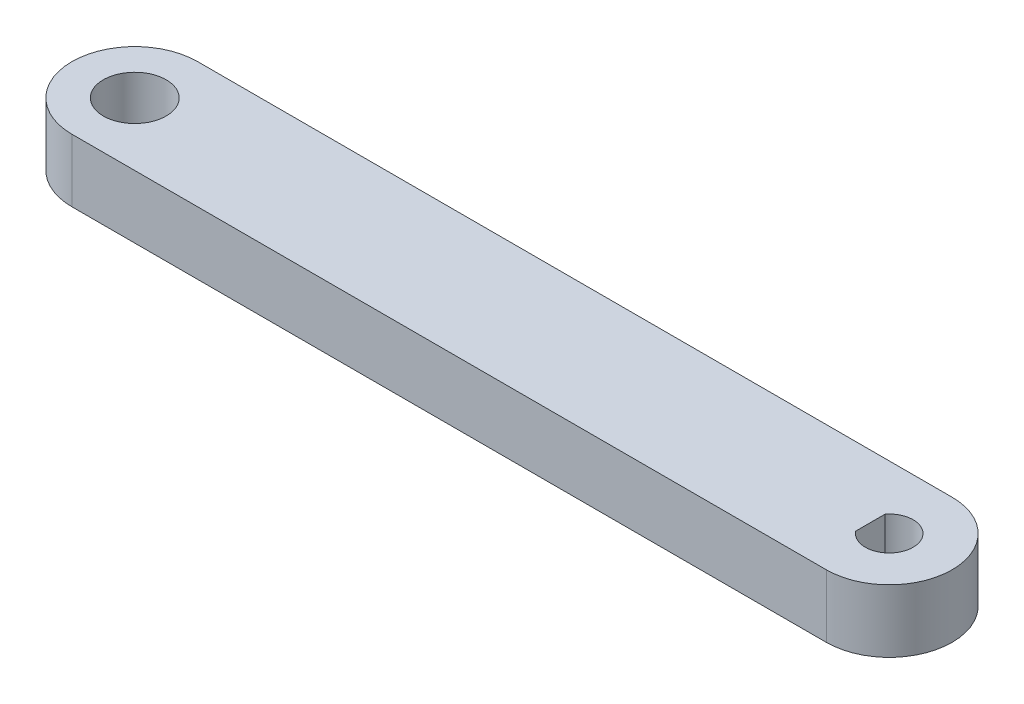
ISO-10303-21;
HEADER;
FILE_DESCRIPTION(('STEP AP214'),'2;1');
FILE_NAME('part.step','',(''),(''),'','','');
FILE_SCHEMA(('AUTOMOTIVE_DESIGN { 1 0 10303 214 1 1 1 1 }'));
ENDSEC;
DATA;
#1=APPLICATION_CONTEXT('core data for automotive mechanical design processes');
#2=APPLICATION_PROTOCOL_DEFINITION('international standard','automotive_design',2000,#1);
#3=PRODUCT_CONTEXT('',#1,'mechanical');
#4=PRODUCT('Part','Part','',(#3));
#5=PRODUCT_RELATED_PRODUCT_CATEGORY('part','',(#4));
#6=PRODUCT_DEFINITION_FORMATION('','',#4);
#7=PRODUCT_DEFINITION_CONTEXT('part definition',#1,'design');
#8=PRODUCT_DEFINITION('design','',#6,#7);
#9=PRODUCT_DEFINITION_SHAPE('','',#8);
#10=(LENGTH_UNIT() NAMED_UNIT(*) SI_UNIT(.MILLI.,.METRE.));
#11=(NAMED_UNIT(*) PLANE_ANGLE_UNIT() SI_UNIT($,.RADIAN.));
#12=(NAMED_UNIT(*) SI_UNIT($,.STERADIAN.) SOLID_ANGLE_UNIT());
#13=UNCERTAINTY_MEASURE_WITH_UNIT(LENGTH_MEASURE(1.E-05),#10,'distance_accuracy_value','');
#14=(GEOMETRIC_REPRESENTATION_CONTEXT(3) GLOBAL_UNCERTAINTY_ASSIGNED_CONTEXT((#13)) GLOBAL_UNIT_ASSIGNED_CONTEXT((#10,
#11,#12)) REPRESENTATION_CONTEXT('',''));
#15=CARTESIAN_POINT('',(0.,0.,0.));
#16=DIRECTION('',(0.,0.,1.));
#17=DIRECTION('',(1.,0.,0.));
#18=AXIS2_PLACEMENT_3D('',#15,#16,#17);
#19=CARTESIAN_POINT('',(0.,6.35,0.));
#20=DIRECTION('',(0.,-1.,0.));
#21=DIRECTION('',(0.,0.,-1.));
#22=AXIS2_PLACEMENT_3D('',#19,#20,#21);
#23=CYLINDRICAL_SURFACE('',#22,6.35);
#24=CARTESIAN_POINT('',(0.,0.,0.));
#25=DIRECTION('',(0.,1.,0.));
#26=DIRECTION('',(0.,0.,1.));
#27=AXIS2_PLACEMENT_3D('',#24,#25,#26);
#28=CIRCLE('',#27,6.35);
#29=CARTESIAN_POINT('',(0.,0.,6.35));
#30=VERTEX_POINT('',#29);
#31=CARTESIAN_POINT('',(0.,0.,-6.35));
#32=VERTEX_POINT('',#31);
#33=EDGE_CURVE('E124',#30,#32,#28,.T.);
#34=ORIENTED_EDGE('',*,*,#33,.T.);
#35=DIRECTION('',(0.,-1.,0.));
#36=VECTOR('',#35,1.);
#37=CARTESIAN_POINT('',(0.,6.35,-6.35));
#38=LINE('',#37,#36);
#39=CARTESIAN_POINT('',(0.,6.35,-6.35));
#40=VERTEX_POINT('',#39);
#41=EDGE_CURVE('E11',#40,#32,#38,.T.);
#42=ORIENTED_EDGE('',*,*,#41,.F.);
#43=CARTESIAN_POINT('',(0.,6.35,0.));
#44=DIRECTION('',(0.,1.,0.));
#45=DIRECTION('',(0.,0.,1.));
#46=AXIS2_PLACEMENT_3D('',#43,#44,#45);
#47=CIRCLE('',#46,6.35);
#48=CARTESIAN_POINT('',(0.,6.35,6.35));
#49=VERTEX_POINT('',#48);
#50=EDGE_CURVE('E126',#49,#40,#47,.T.);
#51=ORIENTED_EDGE('',*,*,#50,.F.);
#52=DIRECTION('',(0.,-1.,0.));
#53=VECTOR('',#52,1.);
#54=CARTESIAN_POINT('',(0.,6.35,6.35));
#55=LINE('',#54,#53);
#56=EDGE_CURVE('E140',#49,#30,#55,.T.);
#57=ORIENTED_EDGE('',*,*,#56,.T.);
#58=EDGE_LOOP('',(#34,#42,#51,#57));
#59=FACE_BOUND('',#58,.T.);
#60=ADVANCED_FACE('F45',(#59),#23,.T.);
#61=CARTESIAN_POINT('',(0.,6.35,-6.35));
#62=DIRECTION('',(0.,0.,1.));
#63=DIRECTION('',(1.,0.,0.));
#64=AXIS2_PLACEMENT_3D('',#61,#62,#63);
#65=PLANE('',#64);
#66=DIRECTION('',(-1.,0.,0.));
#67=VECTOR('',#66,1.);
#68=CARTESIAN_POINT('',(0.,0.,-6.35));
#69=LINE('',#68,#67);
#70=CARTESIAN_POINT('',(-76.2,0.,-6.34999999999999));
#71=VERTEX_POINT('',#70);
#72=EDGE_CURVE('E144',#32,#71,#69,.T.);
#73=ORIENTED_EDGE('',*,*,#72,.T.);
#74=DIRECTION('',(0.,-1.,0.));
#75=VECTOR('',#74,1.);
#76=CARTESIAN_POINT('',(-76.2,6.35,-6.34999999999999));
#77=LINE('',#76,#75);
#78=CARTESIAN_POINT('',(-76.2,6.35,-6.34999999999999));
#79=VERTEX_POINT('',#78);
#80=EDGE_CURVE('E53',#79,#71,#77,.T.);
#81=ORIENTED_EDGE('',*,*,#80,.F.);
#82=DIRECTION('',(-1.,0.,0.));
#83=VECTOR('',#82,1.);
#84=CARTESIAN_POINT('',(0.,6.35,-6.35));
#85=LINE('',#84,#83);
#86=EDGE_CURVE('E130',#40,#79,#85,.T.);
#87=ORIENTED_EDGE('',*,*,#86,.F.);
#88=ORIENTED_EDGE('',*,*,#41,.T.);
#89=EDGE_LOOP('',(#73,#81,#87,#88));
#90=FACE_BOUND('',#89,.T.);
#91=ADVANCED_FACE('F178',(#90),#65,.F.);
#92=CARTESIAN_POINT('',(-76.2,6.35,0.));
#93=DIRECTION('',(0.,-1.,0.));
#94=DIRECTION('',(0.,0.,-1.));
#95=AXIS2_PLACEMENT_3D('',#92,#93,#94);
#96=CYLINDRICAL_SURFACE('',#95,6.35);
#97=CARTESIAN_POINT('',(-76.2,0.,0.));
#98=DIRECTION('',(0.,1.,0.));
#99=DIRECTION('',(0.,0.,1.));
#100=AXIS2_PLACEMENT_3D('',#97,#98,#99);
#101=CIRCLE('',#100,6.35);
#102=CARTESIAN_POINT('',(-76.2,0.,6.35000000000001));
#103=VERTEX_POINT('',#102);
#104=EDGE_CURVE('E147',#71,#103,#101,.T.);
#105=ORIENTED_EDGE('',*,*,#104,.T.);
#106=DIRECTION('',(0.,-1.,0.));
#107=VECTOR('',#106,1.);
#108=CARTESIAN_POINT('',(-76.2,6.35,6.35000000000001));
#109=LINE('',#108,#107);
#110=CARTESIAN_POINT('',(-76.2,6.35,6.35000000000001));
#111=VERTEX_POINT('',#110);
#112=EDGE_CURVE('E155',#111,#103,#109,.T.);
#113=ORIENTED_EDGE('',*,*,#112,.F.);
#114=CARTESIAN_POINT('',(-76.2,6.35,0.));
#115=DIRECTION('',(0.,1.,0.));
#116=DIRECTION('',(0.,0.,1.));
#117=AXIS2_PLACEMENT_3D('',#114,#115,#116);
#118=CIRCLE('',#117,6.35);
#119=EDGE_CURVE('E134',#79,#111,#118,.T.);
#120=ORIENTED_EDGE('',*,*,#119,.F.);
#121=ORIENTED_EDGE('',*,*,#80,.T.);
#122=EDGE_LOOP('',(#105,#113,#120,#121));
#123=FACE_BOUND('',#122,.T.);
#124=ADVANCED_FACE('F164',(#123),#96,.T.);
#125=CARTESIAN_POINT('',(0.,6.35,6.35));
#126=DIRECTION('',(0.,0.,-1.));
#127=DIRECTION('',(-1.,0.,0.));
#128=AXIS2_PLACEMENT_3D('',#125,#126,#127);
#129=PLANE('',#128);
#130=DIRECTION('',(1.,0.,0.));
#131=VECTOR('',#130,1.);
#132=CARTESIAN_POINT('',(0.,0.,6.35));
#133=LINE('',#132,#131);
#134=EDGE_CURVE('E131',#103,#30,#133,.T.);
#135=ORIENTED_EDGE('',*,*,#134,.T.);
#136=ORIENTED_EDGE('',*,*,#56,.F.);
#137=DIRECTION('',(1.,0.,0.));
#138=VECTOR('',#137,1.);
#139=CARTESIAN_POINT('',(0.,6.35,6.35));
#140=LINE('',#139,#138);
#141=EDGE_CURVE('E137',#111,#49,#140,.T.);
#142=ORIENTED_EDGE('',*,*,#141,.F.);
#143=ORIENTED_EDGE('',*,*,#112,.T.);
#144=EDGE_LOOP('',(#135,#136,#142,#143));
#145=FACE_BOUND('',#144,.T.);
#146=ADVANCED_FACE('F171',(#145),#129,.F.);
#147=CARTESIAN_POINT('',(0.,6.35,0.));
#148=DIRECTION('',(0.,1.,0.));
#149=DIRECTION('',(0.,0.,1.));
#150=AXIS2_PLACEMENT_3D('',#147,#148,#149);
#151=PLANE('',#150);
#152=CARTESIAN_POINT('',(-76.2,6.35,0.));
#153=DIRECTION('',(0.,1.,0.));
#154=DIRECTION('',(0.,0.,1.));
#155=AXIS2_PLACEMENT_3D('',#152,#153,#154);
#156=CIRCLE('',#155,3.175);
#157=CARTESIAN_POINT('',(-76.2,6.35,3.17500000000001));
#158=VERTEX_POINT('',#157);
#159=EDGE_CURVE('E117',#158,#158,#156,.T.);
#160=ORIENTED_EDGE('',*,*,#159,.F.);
#161=EDGE_LOOP('',(#160));
#162=FACE_BOUND('',#161,.T.);
#163=CARTESIAN_POINT('',(0.,6.35,0.));
#164=DIRECTION('',(0.,1.,0.));
#165=DIRECTION('',(0.,0.,-1.));
#166=AXIS2_PLACEMENT_3D('',#163,#164,#165);
#167=CIRCLE('',#166,2.413);
#168=CARTESIAN_POINT('',(-1.905,6.35,1.48106178129071));
#169=VERTEX_POINT('',#168);
#170=CARTESIAN_POINT('',(-1.905,6.35,-1.48106178129071));
#171=VERTEX_POINT('',#170);
#172=EDGE_CURVE('E60',#169,#171,#167,.T.);
#173=ORIENTED_EDGE('',*,*,#172,.F.);
#174=DIRECTION('',(0.,0.,1.));
#175=VECTOR('',#174,1.);
#176=CARTESIAN_POINT('',(-1.905,6.35,1.48106178129071));
#177=LINE('',#176,#175);
#178=EDGE_CURVE('E112',#171,#169,#177,.T.);
#179=ORIENTED_EDGE('',*,*,#178,.F.);
#180=EDGE_LOOP('',(#173,#179));
#181=FACE_BOUND('',#180,.T.);
#182=ORIENTED_EDGE('',*,*,#50,.T.);
#183=ORIENTED_EDGE('',*,*,#86,.T.);
#184=ORIENTED_EDGE('',*,*,#119,.T.);
#185=ORIENTED_EDGE('',*,*,#141,.T.);
#186=EDGE_LOOP('',(#182,#183,#184,#185));
#187=FACE_BOUND('',#186,.T.);
#188=ADVANCED_FACE('F177',(#162,#181,#187),#151,.T.);
#189=CARTESIAN_POINT('',(0.,0.,0.));
#190=DIRECTION('',(0.,1.,0.));
#191=DIRECTION('',(0.,0.,1.));
#192=AXIS2_PLACEMENT_3D('',#189,#190,#191);
#193=PLANE('',#192);
#194=CARTESIAN_POINT('',(-76.2,0.,0.));
#195=DIRECTION('',(0.,1.,0.));
#196=DIRECTION('',(0.,0.,1.));
#197=AXIS2_PLACEMENT_3D('',#194,#195,#196);
#198=CIRCLE('',#197,3.175);
#199=CARTESIAN_POINT('',(-76.2,0.,3.17500000000001));
#200=VERTEX_POINT('',#199);
#201=EDGE_CURVE('E121',#200,#200,#198,.T.);
#202=ORIENTED_EDGE('',*,*,#201,.T.);
#203=EDGE_LOOP('',(#202));
#204=FACE_BOUND('',#203,.T.);
#205=DIRECTION('',(0.,0.,1.));
#206=VECTOR('',#205,1.);
#207=CARTESIAN_POINT('',(-1.905,0.,1.48106178129071));
#208=LINE('',#207,#206);
#209=CARTESIAN_POINT('',(-1.905,0.,-1.48106178129071));
#210=VERTEX_POINT('',#209);
#211=CARTESIAN_POINT('',(-1.905,0.,1.48106178129071));
#212=VERTEX_POINT('',#211);
#213=EDGE_CURVE('E102',#210,#212,#208,.T.);
#214=ORIENTED_EDGE('',*,*,#213,.T.);
#215=CARTESIAN_POINT('',(0.,0.,0.));
#216=DIRECTION('',(0.,1.,0.));
#217=DIRECTION('',(0.,0.,-1.));
#218=AXIS2_PLACEMENT_3D('',#215,#216,#217);
#219=CIRCLE('',#218,2.413);
#220=EDGE_CURVE('E65',#212,#210,#219,.T.);
#221=ORIENTED_EDGE('',*,*,#220,.T.);
#222=EDGE_LOOP('',(#214,#221));
#223=FACE_BOUND('',#222,.T.);
#224=ORIENTED_EDGE('',*,*,#33,.F.);
#225=ORIENTED_EDGE('',*,*,#134,.F.);
#226=ORIENTED_EDGE('',*,*,#104,.F.);
#227=ORIENTED_EDGE('',*,*,#72,.F.);
#228=EDGE_LOOP('',(#224,#225,#226,#227));
#229=FACE_BOUND('',#228,.T.);
#230=ADVANCED_FACE('F109',(#204,#223,#229),#193,.F.);
#231=CARTESIAN_POINT('',(0.,0.,0.));
#232=DIRECTION('',(0.,1.,0.));
#233=DIRECTION('',(0.,0.,1.));
#234=AXIS2_PLACEMENT_3D('',#231,#232,#233);
#235=CYLINDRICAL_SURFACE('',#234,2.413);
#236=ORIENTED_EDGE('',*,*,#172,.T.);
#237=DIRECTION('',(0.,1.,0.));
#238=VECTOR('',#237,1.);
#239=CARTESIAN_POINT('',(-1.905,0.,-1.48106178129071));
#240=LINE('',#239,#238);
#241=EDGE_CURVE('E94',#210,#171,#240,.T.);
#242=ORIENTED_EDGE('',*,*,#241,.F.);
#243=ORIENTED_EDGE('',*,*,#220,.F.);
#244=DIRECTION('',(0.,1.,0.));
#245=VECTOR('',#244,1.);
#246=CARTESIAN_POINT('',(-1.905,0.,1.48106178129071));
#247=LINE('',#246,#245);
#248=EDGE_CURVE('E101',#212,#169,#247,.T.);
#249=ORIENTED_EDGE('',*,*,#248,.T.);
#250=EDGE_LOOP('',(#236,#242,#243,#249));
#251=FACE_BOUND('',#250,.T.);
#252=ADVANCED_FACE('F96',(#251),#235,.F.);
#253=CARTESIAN_POINT('',(-1.905,0.,1.48106178129071));
#254=DIRECTION('',(-1.,0.,0.));
#255=DIRECTION('',(0.,0.,1.));
#256=AXIS2_PLACEMENT_3D('',#253,#254,#255);
#257=PLANE('',#256);
#258=ORIENTED_EDGE('',*,*,#178,.T.);
#259=ORIENTED_EDGE('',*,*,#248,.F.);
#260=ORIENTED_EDGE('',*,*,#213,.F.);
#261=ORIENTED_EDGE('',*,*,#241,.T.);
#262=EDGE_LOOP('',(#258,#259,#260,#261));
#263=FACE_BOUND('',#262,.T.);
#264=ADVANCED_FACE('F105',(#263),#257,.F.);
#265=CARTESIAN_POINT('',(-76.2,0.,0.));
#266=DIRECTION('',(0.,1.,0.));
#267=DIRECTION('',(0.,0.,1.));
#268=AXIS2_PLACEMENT_3D('',#265,#266,#267);
#269=CYLINDRICAL_SURFACE('',#268,3.175);
#270=ORIENTED_EDGE('',*,*,#201,.F.);
#271=EDGE_LOOP('',(#270));
#272=FACE_BOUND('',#271,.T.);
#273=ORIENTED_EDGE('',*,*,#159,.T.);
#274=EDGE_LOOP('',(#273));
#275=FACE_BOUND('',#274,.T.);
#276=ADVANCED_FACE('F198',(#272,#275),#269,.F.);
#277=CLOSED_SHELL('',(#60,#91,#124,#146,#188,#230,#252,#264,#276));
#278=MANIFOLD_SOLID_BREP('B2',#277);
#279=ADVANCED_BREP_SHAPE_REPRESENTATION('',(#18,#278),#14);
#280=SHAPE_DEFINITION_REPRESENTATION(#9,#279);
ENDSEC;
END-ISO-10303-21;
